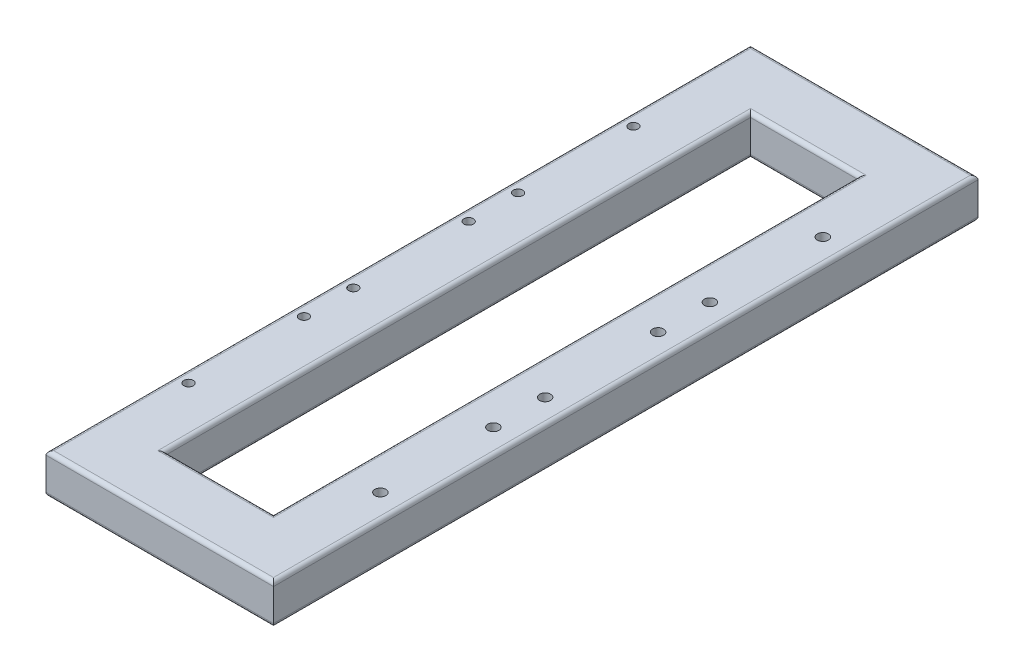
ISO-10303-21;
HEADER;
FILE_DESCRIPTION(('STEP AP214'),'2;1');
FILE_NAME('part.step','',(''),(''),'','','');
FILE_SCHEMA(('AUTOMOTIVE_DESIGN { 1 0 10303 214 1 1 1 1 }'));
ENDSEC;
DATA;
#1=APPLICATION_CONTEXT('core data for automotive mechanical design processes');
#2=APPLICATION_PROTOCOL_DEFINITION('international standard','automotive_design',2000,#1);
#3=PRODUCT_CONTEXT('',#1,'mechanical');
#4=PRODUCT('Part','Part','',(#3));
#5=PRODUCT_RELATED_PRODUCT_CATEGORY('part','',(#4));
#6=PRODUCT_DEFINITION_FORMATION('','',#4);
#7=PRODUCT_DEFINITION_CONTEXT('part definition',#1,'design');
#8=PRODUCT_DEFINITION('design','',#6,#7);
#9=PRODUCT_DEFINITION_SHAPE('','',#8);
#10=(LENGTH_UNIT() NAMED_UNIT(*) SI_UNIT(.MILLI.,.METRE.));
#11=(NAMED_UNIT(*) PLANE_ANGLE_UNIT() SI_UNIT($,.RADIAN.));
#12=(NAMED_UNIT(*) SI_UNIT($,.STERADIAN.) SOLID_ANGLE_UNIT());
#13=UNCERTAINTY_MEASURE_WITH_UNIT(LENGTH_MEASURE(1.E-05),#10,'distance_accuracy_value','');
#14=(GEOMETRIC_REPRESENTATION_CONTEXT(3) GLOBAL_UNCERTAINTY_ASSIGNED_CONTEXT((#13)) GLOBAL_UNIT_ASSIGNED_CONTEXT((#10,
#11,#12)) REPRESENTATION_CONTEXT('',''));
#15=CARTESIAN_POINT('',(0.,0.,0.));
#16=DIRECTION('',(0.,0.,1.));
#17=DIRECTION('',(1.,0.,0.));
#18=AXIS2_PLACEMENT_3D('',#15,#16,#17);
#19=CARTESIAN_POINT('',(0.,50.8,0.));
#20=DIRECTION('',(0.,-1.,0.));
#21=DIRECTION('',(0.,0.,-1.));
#22=AXIS2_PLACEMENT_3D('',#19,#20,#21);
#23=PLANE('',#22);
#24=DIRECTION('',(1.,0.,0.));
#25=VECTOR('',#24,1.);
#26=CARTESIAN_POINT('',(0.,50.8,-5.));
#27=LINE('',#26,#25);
#28=CARTESIAN_POINT('',(-285.,50.8,-5.));
#29=VERTEX_POINT('',#28);
#30=CARTESIAN_POINT('',(-5.,50.8,-5.));
#31=VERTEX_POINT('',#30);
#32=EDGE_CURVE('E177',#29,#31,#27,.T.);
#33=ORIENTED_EDGE('',*,*,#32,.T.);
#34=DIRECTION('',(0.,0.,-1.));
#35=VECTOR('',#34,1.);
#36=CARTESIAN_POINT('',(-5.,50.8,0.));
#37=LINE('',#36,#35);
#38=CARTESIAN_POINT('',(-5.,50.8,-893.));
#39=VERTEX_POINT('',#38);
#40=EDGE_CURVE('E187',#31,#39,#37,.T.);
#41=ORIENTED_EDGE('',*,*,#40,.T.);
#42=DIRECTION('',(-1.,0.,0.));
#43=VECTOR('',#42,1.);
#44=CARTESIAN_POINT('',(0.,50.8,-893.));
#45=LINE('',#44,#43);
#46=CARTESIAN_POINT('',(-285.,50.8,-893.));
#47=VERTEX_POINT('',#46);
#48=EDGE_CURVE('E185',#39,#47,#45,.T.);
#49=ORIENTED_EDGE('',*,*,#48,.T.);
#50=DIRECTION('',(0.,0.,1.));
#51=VECTOR('',#50,1.);
#52=CARTESIAN_POINT('',(-285.,50.8,0.));
#53=LINE('',#52,#51);
#54=EDGE_CURVE('E179',#47,#29,#53,.T.);
#55=ORIENTED_EDGE('',*,*,#54,.T.);
#56=EDGE_LOOP('',(#33,#41,#49,#55));
#57=FACE_BOUND('',#56,.T.);
#58=DIRECTION('',(0.,0.,-1.));
#59=VECTOR('',#58,1.);
#60=CARTESIAN_POINT('',(-71.2,50.8,-76.1999999999997));
#61=LINE('',#60,#59);
#62=CARTESIAN_POINT('',(-71.2,50.8,-826.8));
#63=VERTEX_POINT('',#62);
#64=CARTESIAN_POINT('',(-71.2,50.8,-71.1999999999997));
#65=VERTEX_POINT('',#64);
#66=EDGE_CURVE('E176',#63,#65,#61,.F.);
#67=ORIENTED_EDGE('',*,*,#66,.T.);
#68=DIRECTION('',(1.,0.,0.));
#69=VECTOR('',#68,1.);
#70=CARTESIAN_POINT('',(-213.8,50.8,-71.1999999999997));
#71=LINE('',#70,#69);
#72=CARTESIAN_POINT('',(-218.8,50.8,-71.1999999999997));
#73=VERTEX_POINT('',#72);
#74=EDGE_CURVE('E155',#65,#73,#71,.F.);
#75=ORIENTED_EDGE('',*,*,#74,.T.);
#76=DIRECTION('',(0.,0.,1.));
#77=VECTOR('',#76,1.);
#78=CARTESIAN_POINT('',(-218.8,50.8,-821.8));
#79=LINE('',#78,#77);
#80=CARTESIAN_POINT('',(-218.8,50.8,-826.8));
#81=VERTEX_POINT('',#80);
#82=EDGE_CURVE('E165',#73,#81,#79,.F.);
#83=ORIENTED_EDGE('',*,*,#82,.T.);
#84=DIRECTION('',(-1.,0.,0.));
#85=VECTOR('',#84,1.);
#86=CARTESIAN_POINT('',(-76.2,50.8,-826.8));
#87=LINE('',#86,#85);
#88=EDGE_CURVE('E171',#81,#63,#87,.F.);
#89=ORIENTED_EDGE('',*,*,#88,.T.);
#90=EDGE_LOOP('',(#67,#75,#83,#89));
#91=FACE_BOUND('',#90,.T.);
#92=CARTESIAN_POINT('',(-273.75,50.8,-375.5));
#93=DIRECTION('',(0.,1.,0.));
#94=DIRECTION('',(0.,0.,1.));
#95=AXIS2_PLACEMENT_3D('',#92,#93,#94);
#96=CIRCLE('',#95,5.99999999999999);
#97=CARTESIAN_POINT('',(-273.75,50.8,-369.5));
#98=VERTEX_POINT('',#97);
#99=EDGE_CURVE('E293',#98,#98,#96,.T.);
#100=ORIENTED_EDGE('',*,*,#99,.F.);
#101=EDGE_LOOP('',(#100));
#102=FACE_BOUND('',#101,.T.);
#103=CARTESIAN_POINT('',(-273.75,50.8,-522.5));
#104=DIRECTION('',(0.,1.,0.));
#105=DIRECTION('',(0.,0.,1.));
#106=AXIS2_PLACEMENT_3D('',#103,#104,#105);
#107=CIRCLE('',#106,5.99999999999999);
#108=CARTESIAN_POINT('',(-273.75,50.8,-516.5));
#109=VERTEX_POINT('',#108);
#110=EDGE_CURVE('E393',#109,#109,#107,.T.);
#111=ORIENTED_EDGE('',*,*,#110,.F.);
#112=EDGE_LOOP('',(#111));
#113=FACE_BOUND('',#112,.T.);
#114=CARTESIAN_POINT('',(-30.75,50.8,-377.));
#115=DIRECTION('',(0.,1.,0.));
#116=DIRECTION('',(0.,0.,1.));
#117=AXIS2_PLACEMENT_3D('',#114,#115,#116);
#118=CIRCLE('',#117,6.99999999999999);
#119=CARTESIAN_POINT('',(-30.75,50.8,-370.));
#120=VERTEX_POINT('',#119);
#121=EDGE_CURVE('E389',#120,#120,#118,.T.);
#122=ORIENTED_EDGE('',*,*,#121,.F.);
#123=EDGE_LOOP('',(#122));
#124=FACE_BOUND('',#123,.T.);
#125=CARTESIAN_POINT('',(-30.75,50.8,-521.));
#126=DIRECTION('',(0.,1.,0.));
#127=DIRECTION('',(0.,0.,1.));
#128=AXIS2_PLACEMENT_3D('',#125,#126,#127);
#129=CIRCLE('',#128,6.99999999999999);
#130=CARTESIAN_POINT('',(-30.75,50.8,-514.));
#131=VERTEX_POINT('',#130);
#132=EDGE_CURVE('E385',#131,#131,#129,.T.);
#133=ORIENTED_EDGE('',*,*,#132,.F.);
#134=EDGE_LOOP('',(#133));
#135=FACE_BOUND('',#134,.T.);
#136=CARTESIAN_POINT('',(-30.75,50.8,-311.));
#137=DIRECTION('',(0.,1.,0.));
#138=DIRECTION('',(0.,0.,1.));
#139=AXIS2_PLACEMENT_3D('',#136,#137,#138);
#140=CIRCLE('',#139,6.99999999999999);
#141=CARTESIAN_POINT('',(-30.75,50.8,-304.));
#142=VERTEX_POINT('',#141);
#143=EDGE_CURVE('E381',#142,#142,#140,.T.);
#144=ORIENTED_EDGE('',*,*,#143,.F.);
#145=EDGE_LOOP('',(#144));
#146=FACE_BOUND('',#145,.T.);
#147=CARTESIAN_POINT('',(-273.75,50.8,-165.5));
#148=DIRECTION('',(0.,1.,0.));
#149=DIRECTION('',(0.,0.,1.));
#150=AXIS2_PLACEMENT_3D('',#147,#148,#149);
#151=CIRCLE('',#150,5.99999999999999);
#152=CARTESIAN_POINT('',(-273.75,50.8,-159.5));
#153=VERTEX_POINT('',#152);
#154=EDGE_CURVE('E377',#153,#153,#151,.T.);
#155=ORIENTED_EDGE('',*,*,#154,.F.);
#156=EDGE_LOOP('',(#155));
#157=FACE_BOUND('',#156,.T.);
#158=CARTESIAN_POINT('',(-30.75,50.8,-167.));
#159=DIRECTION('',(0.,1.,0.));
#160=DIRECTION('',(0.,0.,1.));
#161=AXIS2_PLACEMENT_3D('',#158,#159,#160);
#162=CIRCLE('',#161,7.00000000000002);
#163=CARTESIAN_POINT('',(-30.75,50.8,-160.));
#164=VERTEX_POINT('',#163);
#165=EDGE_CURVE('E373',#164,#164,#162,.T.);
#166=ORIENTED_EDGE('',*,*,#165,.F.);
#167=EDGE_LOOP('',(#166));
#168=FACE_BOUND('',#167,.T.);
#169=CARTESIAN_POINT('',(-273.75,50.8,-312.5));
#170=DIRECTION('',(0.,1.,0.));
#171=DIRECTION('',(0.,0.,1.));
#172=AXIS2_PLACEMENT_3D('',#169,#170,#171);
#173=CIRCLE('',#172,5.99999999999999);
#174=CARTESIAN_POINT('',(-273.75,50.8,-306.5));
#175=VERTEX_POINT('',#174);
#176=EDGE_CURVE('E369',#175,#175,#173,.T.);
#177=ORIENTED_EDGE('',*,*,#176,.F.);
#178=EDGE_LOOP('',(#177));
#179=FACE_BOUND('',#178,.T.);
#180=CARTESIAN_POINT('',(-273.75,50.8,-732.5));
#181=DIRECTION('',(0.,1.,0.));
#182=DIRECTION('',(0.,0.,-1.));
#183=AXIS2_PLACEMENT_3D('',#180,#181,#182);
#184=CIRCLE('',#183,5.99999999999999);
#185=CARTESIAN_POINT('',(-273.75,50.8,-738.5));
#186=VERTEX_POINT('',#185);
#187=EDGE_CURVE('E365',#186,#186,#184,.T.);
#188=ORIENTED_EDGE('',*,*,#187,.F.);
#189=EDGE_LOOP('',(#188));
#190=FACE_BOUND('',#189,.T.);
#191=CARTESIAN_POINT('',(-30.75,50.8,-587.));
#192=DIRECTION('',(0.,1.,0.));
#193=DIRECTION('',(0.,0.,-1.));
#194=AXIS2_PLACEMENT_3D('',#191,#192,#193);
#195=CIRCLE('',#194,6.99999999999999);
#196=CARTESIAN_POINT('',(-30.75,50.8,-594.));
#197=VERTEX_POINT('',#196);
#198=EDGE_CURVE('E361',#197,#197,#195,.T.);
#199=ORIENTED_EDGE('',*,*,#198,.F.);
#200=EDGE_LOOP('',(#199));
#201=FACE_BOUND('',#200,.T.);
#202=CARTESIAN_POINT('',(-273.75,50.8,-585.5));
#203=DIRECTION('',(0.,1.,0.));
#204=DIRECTION('',(0.,0.,-1.));
#205=AXIS2_PLACEMENT_3D('',#202,#203,#204);
#206=CIRCLE('',#205,5.99999999999999);
#207=CARTESIAN_POINT('',(-273.75,50.8,-591.5));
#208=VERTEX_POINT('',#207);
#209=EDGE_CURVE('E357',#208,#208,#206,.T.);
#210=ORIENTED_EDGE('',*,*,#209,.F.);
#211=EDGE_LOOP('',(#210));
#212=FACE_BOUND('',#211,.T.);
#213=CARTESIAN_POINT('',(-30.75,50.8,-731.));
#214=DIRECTION('',(0.,1.,0.));
#215=DIRECTION('',(0.,0.,-1.));
#216=AXIS2_PLACEMENT_3D('',#213,#214,#215);
#217=CIRCLE('',#216,7.00000000000002);
#218=CARTESIAN_POINT('',(-30.75,50.8,-738.));
#219=VERTEX_POINT('',#218);
#220=EDGE_CURVE('E352',#219,#219,#217,.T.);
#221=ORIENTED_EDGE('',*,*,#220,.F.);
#222=EDGE_LOOP('',(#221));
#223=FACE_BOUND('',#222,.T.);
#224=ADVANCED_FACE('F34',(#57,#91,#102,#113,#124,#135,#146,#157,#168,#179,#190,#201,#212,#223),
#23,.F.);
#225=CARTESIAN_POINT('',(0.,0.,0.));
#226=DIRECTION('',(0.,-1.,0.));
#227=DIRECTION('',(0.,0.,-1.));
#228=AXIS2_PLACEMENT_3D('',#225,#226,#227);
#229=PLANE('',#228);
#230=DIRECTION('',(0.,0.,1.));
#231=VECTOR('',#230,1.);
#232=CARTESIAN_POINT('',(-285.,0.,-898.));
#233=LINE('',#232,#231);
#234=CARTESIAN_POINT('',(-285.,0.,-5.));
#235=VERTEX_POINT('',#234);
#236=CARTESIAN_POINT('',(-285.,0.,-893.));
#237=VERTEX_POINT('',#236);
#238=EDGE_CURVE('E238',#235,#237,#233,.F.);
#239=ORIENTED_EDGE('',*,*,#238,.T.);
#240=DIRECTION('',(-1.,0.,0.));
#241=VECTOR('',#240,1.);
#242=CARTESIAN_POINT('',(0.,0.,-893.));
#243=LINE('',#242,#241);
#244=CARTESIAN_POINT('',(-5.,0.,-893.));
#245=VERTEX_POINT('',#244);
#246=EDGE_CURVE('E240',#237,#245,#243,.F.);
#247=ORIENTED_EDGE('',*,*,#246,.T.);
#248=DIRECTION('',(0.,0.,-1.));
#249=VECTOR('',#248,1.);
#250=CARTESIAN_POINT('',(-5.,0.,0.));
#251=LINE('',#250,#249);
#252=CARTESIAN_POINT('',(-5.,0.,-5.));
#253=VERTEX_POINT('',#252);
#254=EDGE_CURVE('E236',#245,#253,#251,.F.);
#255=ORIENTED_EDGE('',*,*,#254,.T.);
#256=DIRECTION('',(1.,0.,0.));
#257=VECTOR('',#256,1.);
#258=CARTESIAN_POINT('',(-290.,0.,-5.));
#259=LINE('',#258,#257);
#260=EDGE_CURVE('E234',#253,#235,#259,.F.);
#261=ORIENTED_EDGE('',*,*,#260,.T.);
#262=EDGE_LOOP('',(#239,#247,#255,#261));
#263=FACE_BOUND('',#262,.T.);
#264=DIRECTION('',(0.,0.,1.));
#265=VECTOR('',#264,1.);
#266=CARTESIAN_POINT('',(-218.8,0.,0.));
#267=LINE('',#266,#265);
#268=CARTESIAN_POINT('',(-218.8,0.,-826.8));
#269=VERTEX_POINT('',#268);
#270=CARTESIAN_POINT('',(-218.8,0.,-71.1999999999997));
#271=VERTEX_POINT('',#270);
#272=EDGE_CURVE('E229',#269,#271,#267,.T.);
#273=ORIENTED_EDGE('',*,*,#272,.T.);
#274=DIRECTION('',(1.,0.,0.));
#275=VECTOR('',#274,1.);
#276=CARTESIAN_POINT('',(0.,0.,-71.1999999999997));
#277=LINE('',#276,#275);
#278=CARTESIAN_POINT('',(-71.2,0.,-71.1999999999997));
#279=VERTEX_POINT('',#278);
#280=EDGE_CURVE('E231',#271,#279,#277,.T.);
#281=ORIENTED_EDGE('',*,*,#280,.T.);
#282=DIRECTION('',(0.,0.,-1.));
#283=VECTOR('',#282,1.);
#284=CARTESIAN_POINT('',(-71.2,0.,0.));
#285=LINE('',#284,#283);
#286=CARTESIAN_POINT('',(-71.2,0.,-826.8));
#287=VERTEX_POINT('',#286);
#288=EDGE_CURVE('E225',#279,#287,#285,.T.);
#289=ORIENTED_EDGE('',*,*,#288,.T.);
#290=DIRECTION('',(-1.,0.,0.));
#291=VECTOR('',#290,1.);
#292=CARTESIAN_POINT('',(0.,0.,-826.8));
#293=LINE('',#292,#291);
#294=EDGE_CURVE('E227',#287,#269,#293,.T.);
#295=ORIENTED_EDGE('',*,*,#294,.T.);
#296=EDGE_LOOP('',(#273,#281,#289,#295));
#297=FACE_BOUND('',#296,.T.);
#298=CARTESIAN_POINT('',(-273.75,0.,-585.5));
#299=DIRECTION('',(0.,1.,0.));
#300=DIRECTION('',(0.,0.,-1.));
#301=AXIS2_PLACEMENT_3D('',#298,#299,#300);
#302=CIRCLE('',#301,5.99999999999999);
#303=CARTESIAN_POINT('',(-273.75,0.,-591.5));
#304=VERTEX_POINT('',#303);
#305=EDGE_CURVE('E308',#304,#304,#302,.T.);
#306=ORIENTED_EDGE('',*,*,#305,.T.);
#307=EDGE_LOOP('',(#306));
#308=FACE_BOUND('',#307,.T.);
#309=CARTESIAN_POINT('',(-273.75,0.,-732.5));
#310=DIRECTION('',(0.,1.,0.));
#311=DIRECTION('',(0.,0.,-1.));
#312=AXIS2_PLACEMENT_3D('',#309,#310,#311);
#313=CIRCLE('',#312,5.99999999999999);
#314=CARTESIAN_POINT('',(-273.75,0.,-738.5));
#315=VERTEX_POINT('',#314);
#316=EDGE_CURVE('E312',#315,#315,#313,.T.);
#317=ORIENTED_EDGE('',*,*,#316,.T.);
#318=EDGE_LOOP('',(#317));
#319=FACE_BOUND('',#318,.T.);
#320=CARTESIAN_POINT('',(-30.75,0.,-167.));
#321=DIRECTION('',(0.,1.,0.));
#322=DIRECTION('',(0.,0.,1.));
#323=AXIS2_PLACEMENT_3D('',#320,#321,#322);
#324=CIRCLE('',#323,7.00000000000002);
#325=CARTESIAN_POINT('',(-30.75,0.,-160.));
#326=VERTEX_POINT('',#325);
#327=EDGE_CURVE('E316',#326,#326,#324,.T.);
#328=ORIENTED_EDGE('',*,*,#327,.T.);
#329=EDGE_LOOP('',(#328));
#330=FACE_BOUND('',#329,.T.);
#331=CARTESIAN_POINT('',(-30.75,0.,-311.));
#332=DIRECTION('',(0.,1.,0.));
#333=DIRECTION('',(0.,0.,1.));
#334=AXIS2_PLACEMENT_3D('',#331,#332,#333);
#335=CIRCLE('',#334,6.99999999999999);
#336=CARTESIAN_POINT('',(-30.75,0.,-304.));
#337=VERTEX_POINT('',#336);
#338=EDGE_CURVE('E320',#337,#337,#335,.T.);
#339=ORIENTED_EDGE('',*,*,#338,.T.);
#340=EDGE_LOOP('',(#339));
#341=FACE_BOUND('',#340,.T.);
#342=CARTESIAN_POINT('',(-30.75,0.,-377.));
#343=DIRECTION('',(0.,1.,0.));
#344=DIRECTION('',(0.,0.,1.));
#345=AXIS2_PLACEMENT_3D('',#342,#343,#344);
#346=CIRCLE('',#345,6.99999999999999);
#347=CARTESIAN_POINT('',(-30.75,0.,-370.));
#348=VERTEX_POINT('',#347);
#349=EDGE_CURVE('E324',#348,#348,#346,.T.);
#350=ORIENTED_EDGE('',*,*,#349,.T.);
#351=EDGE_LOOP('',(#350));
#352=FACE_BOUND('',#351,.T.);
#353=CARTESIAN_POINT('',(-273.75,0.,-375.5));
#354=DIRECTION('',(0.,1.,0.));
#355=DIRECTION('',(0.,0.,1.));
#356=AXIS2_PLACEMENT_3D('',#353,#354,#355);
#357=CIRCLE('',#356,5.99999999999999);
#358=CARTESIAN_POINT('',(-273.75,0.,-369.5));
#359=VERTEX_POINT('',#358);
#360=EDGE_CURVE('E328',#359,#359,#357,.T.);
#361=ORIENTED_EDGE('',*,*,#360,.T.);
#362=EDGE_LOOP('',(#361));
#363=FACE_BOUND('',#362,.T.);
#364=CARTESIAN_POINT('',(-273.75,0.,-522.5));
#365=DIRECTION('',(0.,1.,0.));
#366=DIRECTION('',(0.,0.,1.));
#367=AXIS2_PLACEMENT_3D('',#364,#365,#366);
#368=CIRCLE('',#367,5.99999999999999);
#369=CARTESIAN_POINT('',(-273.75,0.,-516.5));
#370=VERTEX_POINT('',#369);
#371=EDGE_CURVE('E332',#370,#370,#368,.T.);
#372=ORIENTED_EDGE('',*,*,#371,.T.);
#373=EDGE_LOOP('',(#372));
#374=FACE_BOUND('',#373,.T.);
#375=CARTESIAN_POINT('',(-30.75,0.,-521.));
#376=DIRECTION('',(0.,1.,0.));
#377=DIRECTION('',(0.,0.,1.));
#378=AXIS2_PLACEMENT_3D('',#375,#376,#377);
#379=CIRCLE('',#378,6.99999999999999);
#380=CARTESIAN_POINT('',(-30.75,0.,-514.));
#381=VERTEX_POINT('',#380);
#382=EDGE_CURVE('E336',#381,#381,#379,.T.);
#383=ORIENTED_EDGE('',*,*,#382,.T.);
#384=EDGE_LOOP('',(#383));
#385=FACE_BOUND('',#384,.T.);
#386=CARTESIAN_POINT('',(-273.75,0.,-165.5));
#387=DIRECTION('',(0.,1.,0.));
#388=DIRECTION('',(0.,0.,1.));
#389=AXIS2_PLACEMENT_3D('',#386,#387,#388);
#390=CIRCLE('',#389,5.99999999999999);
#391=CARTESIAN_POINT('',(-273.75,0.,-159.5));
#392=VERTEX_POINT('',#391);
#393=EDGE_CURVE('E340',#392,#392,#390,.T.);
#394=ORIENTED_EDGE('',*,*,#393,.T.);
#395=EDGE_LOOP('',(#394));
#396=FACE_BOUND('',#395,.T.);
#397=CARTESIAN_POINT('',(-273.75,0.,-312.5));
#398=DIRECTION('',(0.,1.,0.));
#399=DIRECTION('',(0.,0.,1.));
#400=AXIS2_PLACEMENT_3D('',#397,#398,#399);
#401=CIRCLE('',#400,5.99999999999999);
#402=CARTESIAN_POINT('',(-273.75,0.,-306.5));
#403=VERTEX_POINT('',#402);
#404=EDGE_CURVE('E344',#403,#403,#401,.T.);
#405=ORIENTED_EDGE('',*,*,#404,.T.);
#406=EDGE_LOOP('',(#405));
#407=FACE_BOUND('',#406,.T.);
#408=CARTESIAN_POINT('',(-30.75,0.,-587.));
#409=DIRECTION('',(0.,1.,0.));
#410=DIRECTION('',(0.,0.,-1.));
#411=AXIS2_PLACEMENT_3D('',#408,#409,#410);
#412=CIRCLE('',#411,6.99999999999999);
#413=CARTESIAN_POINT('',(-30.75,0.,-594.));
#414=VERTEX_POINT('',#413);
#415=EDGE_CURVE('E348',#414,#414,#412,.T.);
#416=ORIENTED_EDGE('',*,*,#415,.T.);
#417=EDGE_LOOP('',(#416));
#418=FACE_BOUND('',#417,.T.);
#419=CARTESIAN_POINT('',(-30.75,0.,-731.));
#420=DIRECTION('',(0.,1.,0.));
#421=DIRECTION('',(0.,0.,-1.));
#422=AXIS2_PLACEMENT_3D('',#419,#420,#421);
#423=CIRCLE('',#422,7.00000000000002);
#424=CARTESIAN_POINT('',(-30.75,0.,-738.));
#425=VERTEX_POINT('',#424);
#426=EDGE_CURVE('E217',#425,#425,#423,.T.);
#427=ORIENTED_EDGE('',*,*,#426,.T.);
#428=EDGE_LOOP('',(#427));
#429=FACE_BOUND('',#428,.T.);
#430=ADVANCED_FACE('F299',(#263,#297,#308,#319,#330,#341,#352,#363,#374,#385,#396,#407,#418,
#429),#229,.T.);
#431=CARTESIAN_POINT('',(0.,50.8,0.));
#432=DIRECTION('',(-1.,0.,0.));
#433=DIRECTION('',(0.,0.,1.));
#434=AXIS2_PLACEMENT_3D('',#431,#432,#433);
#435=PLANE('',#434);
#436=DIRECTION('',(0.,-1.,0.));
#437=VECTOR('',#436,1.);
#438=CARTESIAN_POINT('',(0.,50.8,0.));
#439=LINE('',#438,#437);
#440=CARTESIAN_POINT('',(0.,45.8,0.));
#441=VERTEX_POINT('',#440);
#442=CARTESIAN_POINT('',(0.,5.,0.));
#443=VERTEX_POINT('',#442);
#444=EDGE_CURVE('E404',#441,#443,#439,.T.);
#445=ORIENTED_EDGE('',*,*,#444,.T.);
#446=DIRECTION('',(0.,0.,-1.));
#447=VECTOR('',#446,1.);
#448=CARTESIAN_POINT('',(0.,5.,-898.));
#449=LINE('',#448,#447);
#450=CARTESIAN_POINT('',(0.,5.,-898.));
#451=VERTEX_POINT('',#450);
#452=EDGE_CURVE('E245',#443,#451,#449,.T.);
#453=ORIENTED_EDGE('',*,*,#452,.T.);
#454=DIRECTION('',(0.,-1.,0.));
#455=VECTOR('',#454,1.);
#456=CARTESIAN_POINT('',(0.,50.8,-898.));
#457=LINE('',#456,#455);
#458=CARTESIAN_POINT('',(0.,45.8,-898.));
#459=VERTEX_POINT('',#458);
#460=EDGE_CURVE('E172',#459,#451,#457,.T.);
#461=ORIENTED_EDGE('',*,*,#460,.F.);
#462=DIRECTION('',(0.,0.,-1.));
#463=VECTOR('',#462,1.);
#464=CARTESIAN_POINT('',(0.,45.8,0.));
#465=LINE('',#464,#463);
#466=EDGE_CURVE('E190',#459,#441,#465,.F.);
#467=ORIENTED_EDGE('',*,*,#466,.T.);
#468=EDGE_LOOP('',(#445,#453,#461,#467));
#469=FACE_BOUND('',#468,.T.);
#470=ADVANCED_FACE('F302',(#469),#435,.F.);
#471=CARTESIAN_POINT('',(-290.,50.8,-898.));
#472=DIRECTION('',(0.,0.,1.));
#473=DIRECTION('',(1.,0.,0.));
#474=AXIS2_PLACEMENT_3D('',#471,#472,#473);
#475=PLANE('',#474);
#476=ORIENTED_EDGE('',*,*,#460,.T.);
#477=DIRECTION('',(-1.,0.,0.));
#478=VECTOR('',#477,1.);
#479=CARTESIAN_POINT('',(-290.,5.,-898.));
#480=LINE('',#479,#478);
#481=CARTESIAN_POINT('',(-290.,5.,-898.));
#482=VERTEX_POINT('',#481);
#483=EDGE_CURVE('E206',#451,#482,#480,.T.);
#484=ORIENTED_EDGE('',*,*,#483,.T.);
#485=DIRECTION('',(0.,-1.,0.));
#486=VECTOR('',#485,1.);
#487=CARTESIAN_POINT('',(-290.,50.8,-898.));
#488=LINE('',#487,#486);
#489=CARTESIAN_POINT('',(-290.,45.8,-898.));
#490=VERTEX_POINT('',#489);
#491=EDGE_CURVE('E410',#490,#482,#488,.T.);
#492=ORIENTED_EDGE('',*,*,#491,.F.);
#493=DIRECTION('',(-1.,0.,0.));
#494=VECTOR('',#493,1.);
#495=CARTESIAN_POINT('',(-290.,45.8,-898.));
#496=LINE('',#495,#494);
#497=EDGE_CURVE('E193',#490,#459,#496,.F.);
#498=ORIENTED_EDGE('',*,*,#497,.T.);
#499=EDGE_LOOP('',(#476,#484,#492,#498));
#500=FACE_BOUND('',#499,.T.);
#501=ADVANCED_FACE('F446',(#500),#475,.F.);
#502=CARTESIAN_POINT('',(-290.,50.8,0.));
#503=DIRECTION('',(1.,0.,0.));
#504=DIRECTION('',(0.,0.,-1.));
#505=AXIS2_PLACEMENT_3D('',#502,#503,#504);
#506=PLANE('',#505);
#507=ORIENTED_EDGE('',*,*,#491,.T.);
#508=DIRECTION('',(0.,0.,1.));
#509=VECTOR('',#508,1.);
#510=CARTESIAN_POINT('',(-290.,5.,0.));
#511=LINE('',#510,#509);
#512=CARTESIAN_POINT('',(-290.,5.,0.));
#513=VERTEX_POINT('',#512);
#514=EDGE_CURVE('E243',#482,#513,#511,.T.);
#515=ORIENTED_EDGE('',*,*,#514,.T.);
#516=DIRECTION('',(0.,-1.,0.));
#517=VECTOR('',#516,1.);
#518=CARTESIAN_POINT('',(-290.,50.8,0.));
#519=LINE('',#518,#517);
#520=CARTESIAN_POINT('',(-290.,45.8,0.));
#521=VERTEX_POINT('',#520);
#522=EDGE_CURVE('E407',#521,#513,#519,.T.);
#523=ORIENTED_EDGE('',*,*,#522,.F.);
#524=DIRECTION('',(0.,0.,1.));
#525=VECTOR('',#524,1.);
#526=CARTESIAN_POINT('',(-290.,45.8,0.));
#527=LINE('',#526,#525);
#528=EDGE_CURVE('E195',#521,#490,#527,.F.);
#529=ORIENTED_EDGE('',*,*,#528,.T.);
#530=EDGE_LOOP('',(#507,#515,#523,#529));
#531=FACE_BOUND('',#530,.T.);
#532=ADVANCED_FACE('F442',(#531),#506,.F.);
#533=CARTESIAN_POINT('',(-290.,50.8,0.));
#534=DIRECTION('',(0.,0.,-1.));
#535=DIRECTION('',(-1.,0.,0.));
#536=AXIS2_PLACEMENT_3D('',#533,#534,#535);
#537=PLANE('',#536);
#538=ORIENTED_EDGE('',*,*,#522,.T.);
#539=DIRECTION('',(1.,0.,0.));
#540=VECTOR('',#539,1.);
#541=CARTESIAN_POINT('',(0.,5.,0.));
#542=LINE('',#541,#540);
#543=EDGE_CURVE('E247',#513,#443,#542,.T.);
#544=ORIENTED_EDGE('',*,*,#543,.T.);
#545=ORIENTED_EDGE('',*,*,#444,.F.);
#546=DIRECTION('',(1.,0.,0.));
#547=VECTOR('',#546,1.);
#548=CARTESIAN_POINT('',(-290.,45.8,0.));
#549=LINE('',#548,#547);
#550=EDGE_CURVE('E197',#441,#521,#549,.F.);
#551=ORIENTED_EDGE('',*,*,#550,.T.);
#552=EDGE_LOOP('',(#538,#544,#545,#551));
#553=FACE_BOUND('',#552,.T.);
#554=ADVANCED_FACE('F439',(#553),#537,.F.);
#555=CARTESIAN_POINT('',(-76.2,50.8,-76.1999999999997));
#556=DIRECTION('',(-1.,0.,0.));
#557=DIRECTION('',(0.,0.,1.));
#558=AXIS2_PLACEMENT_3D('',#555,#556,#557);
#559=PLANE('',#558);
#560=DIRECTION('',(0.,-1.,0.));
#561=VECTOR('',#560,1.);
#562=CARTESIAN_POINT('',(-76.2,50.8,-821.8));
#563=LINE('',#562,#561);
#564=CARTESIAN_POINT('',(-76.2,45.8,-821.8));
#565=VERTEX_POINT('',#564);
#566=CARTESIAN_POINT('',(-76.2,5.,-821.8));
#567=VERTEX_POINT('',#566);
#568=EDGE_CURVE('E287',#565,#567,#563,.T.);
#569=ORIENTED_EDGE('',*,*,#568,.T.);
#570=DIRECTION('',(0.,0.,-1.));
#571=VECTOR('',#570,1.);
#572=CARTESIAN_POINT('',(-76.2,5.,-76.1999999999997));
#573=LINE('',#572,#571);
#574=CARTESIAN_POINT('',(-76.2,5.,-76.1999999999997));
#575=VERTEX_POINT('',#574);
#576=EDGE_CURVE('E11',#567,#575,#573,.F.);
#577=ORIENTED_EDGE('',*,*,#576,.T.);
#578=DIRECTION('',(0.,-1.,0.));
#579=VECTOR('',#578,1.);
#580=CARTESIAN_POINT('',(-76.2,50.8,-76.1999999999997));
#581=LINE('',#580,#579);
#582=CARTESIAN_POINT('',(-76.2,45.8,-76.1999999999997));
#583=VERTEX_POINT('',#582);
#584=EDGE_CURVE('E286',#583,#575,#581,.T.);
#585=ORIENTED_EDGE('',*,*,#584,.F.);
#586=DIRECTION('',(0.,0.,-1.));
#587=VECTOR('',#586,1.);
#588=CARTESIAN_POINT('',(-76.2,45.8,-821.8));
#589=LINE('',#588,#587);
#590=EDGE_CURVE('E200',#583,#565,#589,.T.);
#591=ORIENTED_EDGE('',*,*,#590,.T.);
#592=EDGE_LOOP('',(#569,#577,#585,#591));
#593=FACE_BOUND('',#592,.T.);
#594=ADVANCED_FACE('F285',(#593),#559,.T.);
#595=CARTESIAN_POINT('',(-213.8,50.8,-821.8));
#596=DIRECTION('',(0.,0.,1.));
#597=DIRECTION('',(1.,0.,0.));
#598=AXIS2_PLACEMENT_3D('',#595,#596,#597);
#599=PLANE('',#598);
#600=DIRECTION('',(0.,-1.,0.));
#601=VECTOR('',#600,1.);
#602=CARTESIAN_POINT('',(-213.8,50.8,-821.8));
#603=LINE('',#602,#601);
#604=CARTESIAN_POINT('',(-213.8,45.8,-821.8));
#605=VERTEX_POINT('',#604);
#606=CARTESIAN_POINT('',(-213.8,5.,-821.8));
#607=VERTEX_POINT('',#606);
#608=EDGE_CURVE('E401',#605,#607,#603,.T.);
#609=ORIENTED_EDGE('',*,*,#608,.T.);
#610=DIRECTION('',(-1.,0.,0.));
#611=VECTOR('',#610,1.);
#612=CARTESIAN_POINT('',(-213.8,5.,-821.8));
#613=LINE('',#612,#611);
#614=EDGE_CURVE('E43',#607,#567,#613,.F.);
#615=ORIENTED_EDGE('',*,*,#614,.T.);
#616=ORIENTED_EDGE('',*,*,#568,.F.);
#617=DIRECTION('',(-1.,0.,0.));
#618=VECTOR('',#617,1.);
#619=CARTESIAN_POINT('',(-213.8,45.8,-821.8));
#620=LINE('',#619,#618);
#621=EDGE_CURVE('E202',#565,#605,#620,.T.);
#622=ORIENTED_EDGE('',*,*,#621,.T.);
#623=EDGE_LOOP('',(#609,#615,#616,#622));
#624=FACE_BOUND('',#623,.T.);
#625=ADVANCED_FACE('F421',(#624),#599,.T.);
#626=CARTESIAN_POINT('',(-213.8,50.8,-76.1999999999997));
#627=DIRECTION('',(1.,0.,0.));
#628=DIRECTION('',(0.,0.,-1.));
#629=AXIS2_PLACEMENT_3D('',#626,#627,#628);
#630=PLANE('',#629);
#631=DIRECTION('',(0.,-1.,0.));
#632=VECTOR('',#631,1.);
#633=CARTESIAN_POINT('',(-213.8,50.8,-76.1999999999997));
#634=LINE('',#633,#632);
#635=CARTESIAN_POINT('',(-213.8,45.8,-76.1999999999997));
#636=VERTEX_POINT('',#635);
#637=CARTESIAN_POINT('',(-213.8,5.,-76.1999999999997));
#638=VERTEX_POINT('',#637);
#639=EDGE_CURVE('E292',#636,#638,#634,.T.);
#640=ORIENTED_EDGE('',*,*,#639,.T.);
#641=DIRECTION('',(0.,0.,1.));
#642=VECTOR('',#641,1.);
#643=CARTESIAN_POINT('',(-213.8,5.,-76.1999999999997));
#644=LINE('',#643,#642);
#645=EDGE_CURVE('E58',#638,#607,#644,.F.);
#646=ORIENTED_EDGE('',*,*,#645,.T.);
#647=ORIENTED_EDGE('',*,*,#608,.F.);
#648=DIRECTION('',(0.,0.,1.));
#649=VECTOR('',#648,1.);
#650=CARTESIAN_POINT('',(-213.8,45.8,-76.1999999999997));
#651=LINE('',#650,#649);
#652=EDGE_CURVE('E204',#605,#636,#651,.T.);
#653=ORIENTED_EDGE('',*,*,#652,.T.);
#654=EDGE_LOOP('',(#640,#646,#647,#653));
#655=FACE_BOUND('',#654,.T.);
#656=ADVANCED_FACE('F422',(#655),#630,.T.);
#657=CARTESIAN_POINT('',(-213.8,50.8,-76.1999999999997));
#658=DIRECTION('',(0.,0.,-1.));
#659=DIRECTION('',(-1.,0.,0.));
#660=AXIS2_PLACEMENT_3D('',#657,#658,#659);
#661=PLANE('',#660);
#662=ORIENTED_EDGE('',*,*,#584,.T.);
#663=DIRECTION('',(1.,0.,0.));
#664=VECTOR('',#663,1.);
#665=CARTESIAN_POINT('',(-213.8,5.,-76.1999999999997));
#666=LINE('',#665,#664);
#667=EDGE_CURVE('E249',#575,#638,#666,.F.);
#668=ORIENTED_EDGE('',*,*,#667,.T.);
#669=ORIENTED_EDGE('',*,*,#639,.F.);
#670=DIRECTION('',(1.,0.,0.));
#671=VECTOR('',#670,1.);
#672=CARTESIAN_POINT('',(-76.2,45.8,-76.1999999999997));
#673=LINE('',#672,#671);
#674=EDGE_CURVE('E158',#636,#583,#673,.T.);
#675=ORIENTED_EDGE('',*,*,#674,.T.);
#676=EDGE_LOOP('',(#662,#668,#669,#675));
#677=FACE_BOUND('',#676,.T.);
#678=ADVANCED_FACE('F290',(#677),#661,.T.);
#679=CARTESIAN_POINT('',(-273.75,50.8,-375.5));
#680=DIRECTION('',(0.,-1.,0.));
#681=DIRECTION('',(0.,0.,-1.));
#682=AXIS2_PLACEMENT_3D('',#679,#680,#681);
#683=CYLINDRICAL_SURFACE('',#682,5.99999999999999);
#684=ORIENTED_EDGE('',*,*,#99,.T.);
#685=EDGE_LOOP('',(#684));
#686=FACE_BOUND('',#685,.T.);
#687=ORIENTED_EDGE('',*,*,#360,.F.);
#688=EDGE_LOOP('',(#687));
#689=FACE_BOUND('',#688,.T.);
#690=ADVANCED_FACE('F429',(#686,#689),#683,.F.);
#691=CARTESIAN_POINT('',(-273.75,50.8,-522.5));
#692=DIRECTION('',(0.,-1.,0.));
#693=DIRECTION('',(0.,0.,-1.));
#694=AXIS2_PLACEMENT_3D('',#691,#692,#693);
#695=CYLINDRICAL_SURFACE('',#694,5.99999999999999);
#696=ORIENTED_EDGE('',*,*,#110,.T.);
#697=EDGE_LOOP('',(#696));
#698=FACE_BOUND('',#697,.T.);
#699=ORIENTED_EDGE('',*,*,#371,.F.);
#700=EDGE_LOOP('',(#699));
#701=FACE_BOUND('',#700,.T.);
#702=ADVANCED_FACE('F632',(#698,#701),#695,.F.);
#703=CARTESIAN_POINT('',(-30.75,50.8,-377.));
#704=DIRECTION('',(0.,-1.,0.));
#705=DIRECTION('',(0.,0.,-1.));
#706=AXIS2_PLACEMENT_3D('',#703,#704,#705);
#707=CYLINDRICAL_SURFACE('',#706,6.99999999999999);
#708=ORIENTED_EDGE('',*,*,#121,.T.);
#709=EDGE_LOOP('',(#708));
#710=FACE_BOUND('',#709,.T.);
#711=ORIENTED_EDGE('',*,*,#349,.F.);
#712=EDGE_LOOP('',(#711));
#713=FACE_BOUND('',#712,.T.);
#714=ADVANCED_FACE('F624',(#710,#713),#707,.F.);
#715=CARTESIAN_POINT('',(-30.75,50.8,-521.));
#716=DIRECTION('',(0.,-1.,0.));
#717=DIRECTION('',(0.,0.,-1.));
#718=AXIS2_PLACEMENT_3D('',#715,#716,#717);
#719=CYLINDRICAL_SURFACE('',#718,6.99999999999999);
#720=ORIENTED_EDGE('',*,*,#132,.T.);
#721=EDGE_LOOP('',(#720));
#722=FACE_BOUND('',#721,.T.);
#723=ORIENTED_EDGE('',*,*,#382,.F.);
#724=EDGE_LOOP('',(#723));
#725=FACE_BOUND('',#724,.T.);
#726=ADVANCED_FACE('F616',(#722,#725),#719,.F.);
#727=CARTESIAN_POINT('',(-30.75,50.8,-311.));
#728=DIRECTION('',(0.,-1.,0.));
#729=DIRECTION('',(0.,0.,-1.));
#730=AXIS2_PLACEMENT_3D('',#727,#728,#729);
#731=CYLINDRICAL_SURFACE('',#730,6.99999999999999);
#732=ORIENTED_EDGE('',*,*,#143,.T.);
#733=EDGE_LOOP('',(#732));
#734=FACE_BOUND('',#733,.T.);
#735=ORIENTED_EDGE('',*,*,#338,.F.);
#736=EDGE_LOOP('',(#735));
#737=FACE_BOUND('',#736,.T.);
#738=ADVANCED_FACE('F608',(#734,#737),#731,.F.);
#739=CARTESIAN_POINT('',(-273.75,50.8,-165.5));
#740=DIRECTION('',(0.,-1.,0.));
#741=DIRECTION('',(0.,0.,-1.));
#742=AXIS2_PLACEMENT_3D('',#739,#740,#741);
#743=CYLINDRICAL_SURFACE('',#742,5.99999999999999);
#744=ORIENTED_EDGE('',*,*,#154,.T.);
#745=EDGE_LOOP('',(#744));
#746=FACE_BOUND('',#745,.T.);
#747=ORIENTED_EDGE('',*,*,#393,.F.);
#748=EDGE_LOOP('',(#747));
#749=FACE_BOUND('',#748,.T.);
#750=ADVANCED_FACE('F600',(#746,#749),#743,.F.);
#751=CARTESIAN_POINT('',(-30.75,50.8,-167.));
#752=DIRECTION('',(0.,-1.,0.));
#753=DIRECTION('',(0.,0.,-1.));
#754=AXIS2_PLACEMENT_3D('',#751,#752,#753);
#755=CYLINDRICAL_SURFACE('',#754,7.00000000000002);
#756=ORIENTED_EDGE('',*,*,#165,.T.);
#757=EDGE_LOOP('',(#756));
#758=FACE_BOUND('',#757,.T.);
#759=ORIENTED_EDGE('',*,*,#327,.F.);
#760=EDGE_LOOP('',(#759));
#761=FACE_BOUND('',#760,.T.);
#762=ADVANCED_FACE('F592',(#758,#761),#755,.F.);
#763=CARTESIAN_POINT('',(-273.75,50.8,-312.5));
#764=DIRECTION('',(0.,-1.,0.));
#765=DIRECTION('',(0.,0.,-1.));
#766=AXIS2_PLACEMENT_3D('',#763,#764,#765);
#767=CYLINDRICAL_SURFACE('',#766,5.99999999999999);
#768=ORIENTED_EDGE('',*,*,#176,.T.);
#769=EDGE_LOOP('',(#768));
#770=FACE_BOUND('',#769,.T.);
#771=ORIENTED_EDGE('',*,*,#404,.F.);
#772=EDGE_LOOP('',(#771));
#773=FACE_BOUND('',#772,.T.);
#774=ADVANCED_FACE('F584',(#770,#773),#767,.F.);
#775=CARTESIAN_POINT('',(-273.75,50.8,-732.5));
#776=DIRECTION('',(0.,-1.,0.));
#777=DIRECTION('',(0.,0.,-1.));
#778=AXIS2_PLACEMENT_3D('',#775,#776,#777);
#779=CYLINDRICAL_SURFACE('',#778,5.99999999999999);
#780=ORIENTED_EDGE('',*,*,#187,.T.);
#781=EDGE_LOOP('',(#780));
#782=FACE_BOUND('',#781,.T.);
#783=ORIENTED_EDGE('',*,*,#316,.F.);
#784=EDGE_LOOP('',(#783));
#785=FACE_BOUND('',#784,.T.);
#786=ADVANCED_FACE('F576',(#782,#785),#779,.F.);
#787=CARTESIAN_POINT('',(-30.75,50.8,-587.));
#788=DIRECTION('',(0.,-1.,0.));
#789=DIRECTION('',(0.,0.,-1.));
#790=AXIS2_PLACEMENT_3D('',#787,#788,#789);
#791=CYLINDRICAL_SURFACE('',#790,6.99999999999999);
#792=ORIENTED_EDGE('',*,*,#198,.T.);
#793=EDGE_LOOP('',(#792));
#794=FACE_BOUND('',#793,.T.);
#795=ORIENTED_EDGE('',*,*,#415,.F.);
#796=EDGE_LOOP('',(#795));
#797=FACE_BOUND('',#796,.T.);
#798=ADVANCED_FACE('F568',(#794,#797),#791,.F.);
#799=CARTESIAN_POINT('',(-273.75,50.8,-585.5));
#800=DIRECTION('',(0.,-1.,0.));
#801=DIRECTION('',(0.,0.,-1.));
#802=AXIS2_PLACEMENT_3D('',#799,#800,#801);
#803=CYLINDRICAL_SURFACE('',#802,5.99999999999999);
#804=ORIENTED_EDGE('',*,*,#209,.T.);
#805=EDGE_LOOP('',(#804));
#806=FACE_BOUND('',#805,.T.);
#807=ORIENTED_EDGE('',*,*,#305,.F.);
#808=EDGE_LOOP('',(#807));
#809=FACE_BOUND('',#808,.T.);
#810=ADVANCED_FACE('F560',(#806,#809),#803,.F.);
#811=CARTESIAN_POINT('',(-30.75,50.8,-731.));
#812=DIRECTION('',(0.,-1.,0.));
#813=DIRECTION('',(0.,0.,-1.));
#814=AXIS2_PLACEMENT_3D('',#811,#812,#813);
#815=CYLINDRICAL_SURFACE('',#814,7.00000000000002);
#816=ORIENTED_EDGE('',*,*,#220,.T.);
#817=EDGE_LOOP('',(#816));
#818=FACE_BOUND('',#817,.T.);
#819=ORIENTED_EDGE('',*,*,#426,.F.);
#820=EDGE_LOOP('',(#819));
#821=FACE_BOUND('',#820,.T.);
#822=ADVANCED_FACE('F469',(#818,#821),#815,.F.);
#823=CARTESIAN_POINT('',(-285.,45.8,0.));
#824=DIRECTION('',(0.,0.,1.));
#825=DIRECTION('',(1.,0.,0.));
#826=AXIS2_PLACEMENT_3D('',#823,#824,#825);
#827=CYLINDRICAL_SURFACE('',#826,5.);
#828=CARTESIAN_POINT('',(-285.,45.8,-893.));
#829=DIRECTION('',(-0.707106781186547,0.,0.707106781186547));
#830=DIRECTION('',(0.707106781186547,0.,0.707106781186547));
#831=AXIS2_PLACEMENT_3D('',#828,#829,#830);
#832=ELLIPSE('',#831,7.07106781186547,5.);
#833=EDGE_CURVE('E211',#490,#47,#832,.F.);
#834=ORIENTED_EDGE('',*,*,#833,.F.);
#835=ORIENTED_EDGE('',*,*,#528,.F.);
#836=CARTESIAN_POINT('',(-285.,45.8,-5.));
#837=DIRECTION('',(0.707106781186547,0.,0.707106781186547));
#838=DIRECTION('',(0.707106781186547,0.,-0.707106781186547));
#839=AXIS2_PLACEMENT_3D('',#836,#837,#838);
#840=ELLIPSE('',#839,7.07106781186547,5.);
#841=EDGE_CURVE('E214',#29,#521,#840,.T.);
#842=ORIENTED_EDGE('',*,*,#841,.F.);
#843=ORIENTED_EDGE('',*,*,#54,.F.);
#844=EDGE_LOOP('',(#834,#835,#842,#843));
#845=FACE_BOUND('',#844,.T.);
#846=ADVANCED_FACE('F465',(#845),#827,.T.);
#847=CARTESIAN_POINT('',(0.,45.8,-5.));
#848=DIRECTION('',(1.,0.,0.));
#849=DIRECTION('',(0.,0.,-1.));
#850=AXIS2_PLACEMENT_3D('',#847,#848,#849);
#851=CYLINDRICAL_SURFACE('',#850,5.);
#852=ORIENTED_EDGE('',*,*,#841,.T.);
#853=ORIENTED_EDGE('',*,*,#550,.F.);
#854=CARTESIAN_POINT('',(-5.,45.8,-5.));
#855=DIRECTION('',(0.707106781186547,0.,-0.707106781186547));
#856=DIRECTION('',(0.707106781186547,0.,0.707106781186547));
#857=AXIS2_PLACEMENT_3D('',#854,#855,#856);
#858=ELLIPSE('',#857,7.07106781186547,5.);
#859=EDGE_CURVE('E209',#31,#441,#858,.T.);
#860=ORIENTED_EDGE('',*,*,#859,.F.);
#861=ORIENTED_EDGE('',*,*,#32,.F.);
#862=EDGE_LOOP('',(#852,#853,#860,#861));
#863=FACE_BOUND('',#862,.T.);
#864=ADVANCED_FACE('F461',(#863),#851,.T.);
#865=CARTESIAN_POINT('',(0.,45.8,-893.));
#866=DIRECTION('',(-1.,0.,0.));
#867=DIRECTION('',(0.,0.,1.));
#868=AXIS2_PLACEMENT_3D('',#865,#866,#867);
#869=CYLINDRICAL_SURFACE('',#868,5.);
#870=ORIENTED_EDGE('',*,*,#833,.T.);
#871=ORIENTED_EDGE('',*,*,#48,.F.);
#872=CARTESIAN_POINT('',(-5.,45.8,-893.));
#873=DIRECTION('',(-0.707106781186547,0.,-0.707106781186547));
#874=DIRECTION('',(-0.707106781186547,0.,0.707106781186547));
#875=AXIS2_PLACEMENT_3D('',#872,#873,#874);
#876=ELLIPSE('',#875,7.07106781186547,5.);
#877=EDGE_CURVE('E207',#459,#39,#876,.F.);
#878=ORIENTED_EDGE('',*,*,#877,.F.);
#879=ORIENTED_EDGE('',*,*,#497,.F.);
#880=EDGE_LOOP('',(#870,#871,#878,#879));
#881=FACE_BOUND('',#880,.T.);
#882=ADVANCED_FACE('F457',(#881),#869,.T.);
#883=CARTESIAN_POINT('',(-5.,45.8,0.));
#884=DIRECTION('',(0.,0.,-1.));
#885=DIRECTION('',(-1.,0.,0.));
#886=AXIS2_PLACEMENT_3D('',#883,#884,#885);
#887=CYLINDRICAL_SURFACE('',#886,5.);
#888=ORIENTED_EDGE('',*,*,#859,.T.);
#889=ORIENTED_EDGE('',*,*,#466,.F.);
#890=ORIENTED_EDGE('',*,*,#877,.T.);
#891=ORIENTED_EDGE('',*,*,#40,.F.);
#892=EDGE_LOOP('',(#888,#889,#890,#891));
#893=FACE_BOUND('',#892,.T.);
#894=ADVANCED_FACE('F454',(#893),#887,.T.);
#895=CARTESIAN_POINT('',(-213.8,45.8,-826.8));
#896=DIRECTION('',(1.,0.,0.));
#897=DIRECTION('',(0.,0.,-1.));
#898=AXIS2_PLACEMENT_3D('',#895,#896,#897);
#899=CYLINDRICAL_SURFACE('',#898,5.);
#900=CARTESIAN_POINT('',(-71.2,45.8,-826.8));
#901=DIRECTION('',(0.707106781186547,0.,0.707106781186547));
#902=DIRECTION('',(-0.707106781186547,0.,0.707106781186547));
#903=AXIS2_PLACEMENT_3D('',#900,#901,#902);
#904=ELLIPSE('',#903,7.07106781186547,5.);
#905=EDGE_CURVE('E161',#63,#565,#904,.T.);
#906=ORIENTED_EDGE('',*,*,#905,.F.);
#907=ORIENTED_EDGE('',*,*,#88,.F.);
#908=CARTESIAN_POINT('',(-218.8,45.8,-826.8));
#909=DIRECTION('',(0.707106781186547,0.,-0.707106781186547));
#910=DIRECTION('',(0.707106781186547,0.,0.707106781186547));
#911=AXIS2_PLACEMENT_3D('',#908,#909,#910);
#912=ELLIPSE('',#911,7.07106781186547,5.);
#913=EDGE_CURVE('E168',#605,#81,#912,.F.);
#914=ORIENTED_EDGE('',*,*,#913,.F.);
#915=ORIENTED_EDGE('',*,*,#621,.F.);
#916=EDGE_LOOP('',(#906,#907,#914,#915));
#917=FACE_BOUND('',#916,.T.);
#918=ADVANCED_FACE('F417',(#917),#899,.T.);
#919=CARTESIAN_POINT('',(-218.8,45.8,-76.1999999999997));
#920=DIRECTION('',(0.,0.,-1.));
#921=DIRECTION('',(-1.,0.,0.));
#922=AXIS2_PLACEMENT_3D('',#919,#920,#921);
#923=CYLINDRICAL_SURFACE('',#922,5.);
#924=ORIENTED_EDGE('',*,*,#913,.T.);
#925=ORIENTED_EDGE('',*,*,#82,.F.);
#926=CARTESIAN_POINT('',(-218.8,45.8,-71.1999999999997));
#927=DIRECTION('',(-0.707106781186547,0.,-0.707106781186547));
#928=DIRECTION('',(-0.707106781186547,0.,0.707106781186547));
#929=AXIS2_PLACEMENT_3D('',#926,#927,#928);
#930=ELLIPSE('',#929,7.07106781186547,5.);
#931=EDGE_CURVE('E151',#636,#73,#930,.F.);
#932=ORIENTED_EDGE('',*,*,#931,.F.);
#933=ORIENTED_EDGE('',*,*,#652,.F.);
#934=EDGE_LOOP('',(#924,#925,#932,#933));
#935=FACE_BOUND('',#934,.T.);
#936=ADVANCED_FACE('F166',(#935),#923,.T.);
#937=CARTESIAN_POINT('',(-71.2,45.8,-76.1999999999997));
#938=DIRECTION('',(0.,0.,1.));
#939=DIRECTION('',(1.,0.,0.));
#940=AXIS2_PLACEMENT_3D('',#937,#938,#939);
#941=CYLINDRICAL_SURFACE('',#940,5.);
#942=ORIENTED_EDGE('',*,*,#905,.T.);
#943=ORIENTED_EDGE('',*,*,#590,.F.);
#944=CARTESIAN_POINT('',(-71.2,45.8,-71.1999999999997));
#945=DIRECTION('',(-0.707106781186547,0.,0.707106781186547));
#946=DIRECTION('',(-0.707106781186547,0.,-0.707106781186547));
#947=AXIS2_PLACEMENT_3D('',#944,#945,#946);
#948=ELLIPSE('',#947,7.07106781186547,5.);
#949=EDGE_CURVE('E162',#65,#583,#948,.T.);
#950=ORIENTED_EDGE('',*,*,#949,.F.);
#951=ORIENTED_EDGE('',*,*,#66,.F.);
#952=EDGE_LOOP('',(#942,#943,#950,#951));
#953=FACE_BOUND('',#952,.T.);
#954=ADVANCED_FACE('F420',(#953),#941,.T.);
#955=CARTESIAN_POINT('',(-213.8,45.8,-71.1999999999997));
#956=DIRECTION('',(-1.,0.,0.));
#957=DIRECTION('',(0.,0.,1.));
#958=AXIS2_PLACEMENT_3D('',#955,#956,#957);
#959=CYLINDRICAL_SURFACE('',#958,5.);
#960=ORIENTED_EDGE('',*,*,#931,.T.);
#961=ORIENTED_EDGE('',*,*,#74,.F.);
#962=ORIENTED_EDGE('',*,*,#949,.T.);
#963=ORIENTED_EDGE('',*,*,#674,.F.);
#964=EDGE_LOOP('',(#960,#961,#962,#963));
#965=FACE_BOUND('',#964,.T.);
#966=ADVANCED_FACE('F153',(#965),#959,.T.);
#967=CARTESIAN_POINT('',(-290.,5.,-5.));
#968=DIRECTION('',(-1.,0.,0.));
#969=DIRECTION('',(0.,0.,1.));
#970=AXIS2_PLACEMENT_3D('',#967,#968,#969);
#971=CYLINDRICAL_SURFACE('',#970,5.);
#972=CARTESIAN_POINT('',(-285.,5.,-5.));
#973=DIRECTION('',(-0.707106781186547,0.,-0.707106781186547));
#974=DIRECTION('',(-0.707106781186547,0.,0.707106781186547));
#975=AXIS2_PLACEMENT_3D('',#972,#973,#974);
#976=ELLIPSE('',#975,7.07106781186547,5.);
#977=EDGE_CURVE('E258',#235,#513,#976,.T.);
#978=ORIENTED_EDGE('',*,*,#977,.F.);
#979=ORIENTED_EDGE('',*,*,#260,.F.);
#980=CARTESIAN_POINT('',(-5.,5.,-5.));
#981=DIRECTION('',(-0.707106781186547,0.,0.707106781186547));
#982=DIRECTION('',(-0.707106781186547,0.,-0.707106781186547));
#983=AXIS2_PLACEMENT_3D('',#980,#981,#982);
#984=ELLIPSE('',#983,7.07106781186547,5.);
#985=EDGE_CURVE('E218',#443,#253,#984,.F.);
#986=ORIENTED_EDGE('',*,*,#985,.F.);
#987=ORIENTED_EDGE('',*,*,#543,.F.);
#988=EDGE_LOOP('',(#978,#979,#986,#987));
#989=FACE_BOUND('',#988,.T.);
#990=ADVANCED_FACE('F473',(#989),#971,.T.);
#991=CARTESIAN_POINT('',(-5.,5.,0.));
#992=DIRECTION('',(0.,0.,1.));
#993=DIRECTION('',(1.,0.,0.));
#994=AXIS2_PLACEMENT_3D('',#991,#992,#993);
#995=CYLINDRICAL_SURFACE('',#994,5.);
#996=ORIENTED_EDGE('',*,*,#985,.T.);
#997=ORIENTED_EDGE('',*,*,#254,.F.);
#998=CARTESIAN_POINT('',(-5.,5.,-893.));
#999=DIRECTION('',(0.707106781186547,0.,0.707106781186547));
#1000=DIRECTION('',(-0.707106781186547,0.,0.707106781186547));
#1001=AXIS2_PLACEMENT_3D('',#998,#999,#1000);
#1002=ELLIPSE('',#1001,7.07106781186547,5.);
#1003=EDGE_CURVE('E256',#451,#245,#1002,.F.);
#1004=ORIENTED_EDGE('',*,*,#1003,.F.);
#1005=ORIENTED_EDGE('',*,*,#452,.F.);
#1006=EDGE_LOOP('',(#996,#997,#1004,#1005));
#1007=FACE_BOUND('',#1006,.T.);
#1008=ADVANCED_FACE('F487',(#1007),#995,.T.);
#1009=CARTESIAN_POINT('',(-285.,5.,0.));
#1010=DIRECTION('',(0.,0.,-1.));
#1011=DIRECTION('',(-1.,0.,0.));
#1012=AXIS2_PLACEMENT_3D('',#1009,#1010,#1011);
#1013=CYLINDRICAL_SURFACE('',#1012,5.);
#1014=ORIENTED_EDGE('',*,*,#977,.T.);
#1015=ORIENTED_EDGE('',*,*,#514,.F.);
#1016=CARTESIAN_POINT('',(-285.,5.,-893.));
#1017=DIRECTION('',(0.707106781186547,0.,-0.707106781186547));
#1018=DIRECTION('',(-0.707106781186547,0.,-0.707106781186547));
#1019=AXIS2_PLACEMENT_3D('',#1016,#1017,#1018);
#1020=ELLIPSE('',#1019,7.07106781186547,5.);
#1021=EDGE_CURVE('E254',#237,#482,#1020,.T.);
#1022=ORIENTED_EDGE('',*,*,#1021,.F.);
#1023=ORIENTED_EDGE('',*,*,#238,.F.);
#1024=EDGE_LOOP('',(#1014,#1015,#1022,#1023));
#1025=FACE_BOUND('',#1024,.T.);
#1026=ADVANCED_FACE('F483',(#1025),#1013,.T.);
#1027=CARTESIAN_POINT('',(-290.,5.,-893.));
#1028=DIRECTION('',(1.,0.,0.));
#1029=DIRECTION('',(0.,0.,-1.));
#1030=AXIS2_PLACEMENT_3D('',#1027,#1028,#1029);
#1031=CYLINDRICAL_SURFACE('',#1030,5.);
#1032=ORIENTED_EDGE('',*,*,#1003,.T.);
#1033=ORIENTED_EDGE('',*,*,#246,.F.);
#1034=ORIENTED_EDGE('',*,*,#1021,.T.);
#1035=ORIENTED_EDGE('',*,*,#483,.F.);
#1036=EDGE_LOOP('',(#1032,#1033,#1034,#1035));
#1037=FACE_BOUND('',#1036,.T.);
#1038=ADVANCED_FACE('F480',(#1037),#1031,.T.);
#1039=CARTESIAN_POINT('',(0.,5.,-826.8));
#1040=DIRECTION('',(-1.,0.,0.));
#1041=DIRECTION('',(0.,0.,1.));
#1042=AXIS2_PLACEMENT_3D('',#1039,#1040,#1041);
#1043=CYLINDRICAL_SURFACE('',#1042,5.);
#1044=CARTESIAN_POINT('',(-71.2,5.,-826.8));
#1045=DIRECTION('',(-0.707106781186547,0.,-0.707106781186547));
#1046=DIRECTION('',(-0.707106781186547,0.,0.707106781186547));
#1047=AXIS2_PLACEMENT_3D('',#1044,#1045,#1046);
#1048=ELLIPSE('',#1047,7.07106781186547,5.);
#1049=EDGE_CURVE('E266',#567,#287,#1048,.F.);
#1050=ORIENTED_EDGE('',*,*,#1049,.F.);
#1051=ORIENTED_EDGE('',*,*,#614,.F.);
#1052=CARTESIAN_POINT('',(-218.8,5.,-826.8));
#1053=DIRECTION('',(-0.707106781186547,0.,0.707106781186547));
#1054=DIRECTION('',(0.707106781186547,0.,0.707106781186547));
#1055=AXIS2_PLACEMENT_3D('',#1052,#1053,#1054);
#1056=ELLIPSE('',#1055,7.07106781186547,5.);
#1057=EDGE_CURVE('E38',#269,#607,#1056,.T.);
#1058=ORIENTED_EDGE('',*,*,#1057,.F.);
#1059=ORIENTED_EDGE('',*,*,#294,.F.);
#1060=EDGE_LOOP('',(#1050,#1051,#1058,#1059));
#1061=FACE_BOUND('',#1060,.T.);
#1062=ADVANCED_FACE('F36',(#1061),#1043,.T.);
#1063=CARTESIAN_POINT('',(-218.8,5.,0.));
#1064=DIRECTION('',(0.,0.,1.));
#1065=DIRECTION('',(1.,0.,0.));
#1066=AXIS2_PLACEMENT_3D('',#1063,#1064,#1065);
#1067=CYLINDRICAL_SURFACE('',#1066,5.);
#1068=ORIENTED_EDGE('',*,*,#1057,.T.);
#1069=ORIENTED_EDGE('',*,*,#645,.F.);
#1070=CARTESIAN_POINT('',(-218.8,5.,-71.1999999999997));
#1071=DIRECTION('',(0.707106781186547,0.,0.707106781186547));
#1072=DIRECTION('',(0.707106781186547,0.,-0.707106781186547));
#1073=AXIS2_PLACEMENT_3D('',#1070,#1071,#1072);
#1074=ELLIPSE('',#1073,7.07106781186547,5.);
#1075=EDGE_CURVE('E265',#271,#638,#1074,.T.);
#1076=ORIENTED_EDGE('',*,*,#1075,.F.);
#1077=ORIENTED_EDGE('',*,*,#272,.F.);
#1078=EDGE_LOOP('',(#1068,#1069,#1076,#1077));
#1079=FACE_BOUND('',#1078,.T.);
#1080=ADVANCED_FACE('F276',(#1079),#1067,.T.);
#1081=CARTESIAN_POINT('',(-71.2,5.,0.));
#1082=DIRECTION('',(0.,0.,-1.));
#1083=DIRECTION('',(-1.,0.,0.));
#1084=AXIS2_PLACEMENT_3D('',#1081,#1082,#1083);
#1085=CYLINDRICAL_SURFACE('',#1084,5.);
#1086=ORIENTED_EDGE('',*,*,#1049,.T.);
#1087=ORIENTED_EDGE('',*,*,#288,.F.);
#1088=CARTESIAN_POINT('',(-71.2,5.,-71.1999999999997));
#1089=DIRECTION('',(0.707106781186547,0.,-0.707106781186547));
#1090=DIRECTION('',(0.707106781186547,0.,0.707106781186547));
#1091=AXIS2_PLACEMENT_3D('',#1088,#1089,#1090);
#1092=ELLIPSE('',#1091,7.07106781186547,5.);
#1093=EDGE_CURVE('E263',#575,#279,#1092,.F.);
#1094=ORIENTED_EDGE('',*,*,#1093,.F.);
#1095=ORIENTED_EDGE('',*,*,#576,.F.);
#1096=EDGE_LOOP('',(#1086,#1087,#1094,#1095));
#1097=FACE_BOUND('',#1096,.T.);
#1098=ADVANCED_FACE('F281',(#1097),#1085,.T.);
#1099=CARTESIAN_POINT('',(0.,5.,-71.1999999999997));
#1100=DIRECTION('',(1.,0.,0.));
#1101=DIRECTION('',(0.,0.,-1.));
#1102=AXIS2_PLACEMENT_3D('',#1099,#1100,#1101);
#1103=CYLINDRICAL_SURFACE('',#1102,5.);
#1104=ORIENTED_EDGE('',*,*,#1075,.T.);
#1105=ORIENTED_EDGE('',*,*,#667,.F.);
#1106=ORIENTED_EDGE('',*,*,#1093,.T.);
#1107=ORIENTED_EDGE('',*,*,#280,.F.);
#1108=EDGE_LOOP('',(#1104,#1105,#1106,#1107));
#1109=FACE_BOUND('',#1108,.T.);
#1110=ADVANCED_FACE('F296',(#1109),#1103,.T.);
#1111=CLOSED_SHELL('',(#224,#430,#470,#501,#532,#554,#594,#625,#656,#678,#690,#702,#714,#726,
#738,#750,#762,#774,#786,#798,#810,#822,#846,#864,#882,#894,#918,#936,#954,#966,#990,#1008,
#1026,#1038,#1062,#1080,#1098,#1110));
#1112=MANIFOLD_SOLID_BREP('B2',#1111);
#1113=ADVANCED_BREP_SHAPE_REPRESENTATION('',(#18,#1112),#14);
#1114=SHAPE_DEFINITION_REPRESENTATION(#9,#1113);
ENDSEC;
END-ISO-10303-21;
